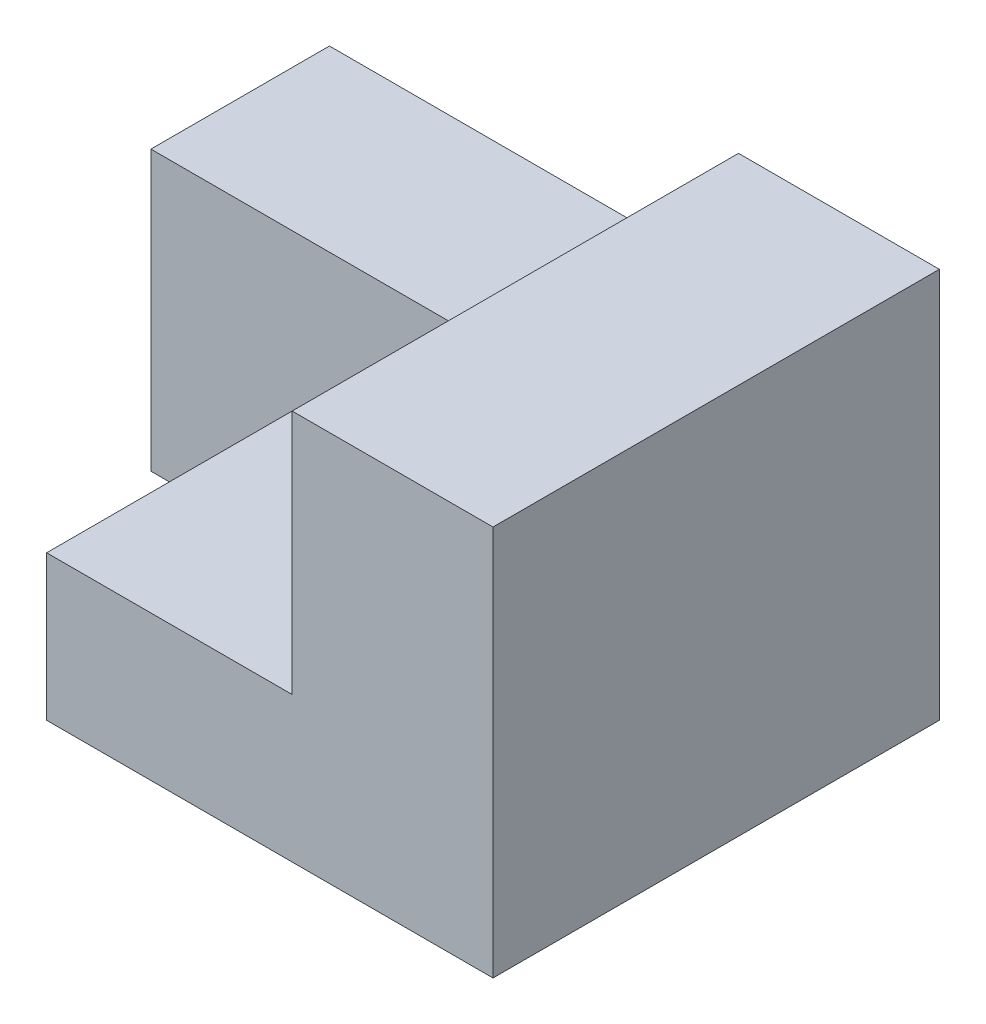
ISO-10303-21;
HEADER;
FILE_DESCRIPTION(('STEP AP214'),'2;1');
FILE_NAME('part.step','',(''),(''),'','','');
FILE_SCHEMA(('AUTOMOTIVE_DESIGN { 1 0 10303 214 1 1 1 1 }'));
ENDSEC;
DATA;
#1=APPLICATION_CONTEXT('core data for automotive mechanical design processes');
#2=APPLICATION_PROTOCOL_DEFINITION('international standard','automotive_design',2000,#1);
#3=PRODUCT_CONTEXT('',#1,'mechanical');
#4=PRODUCT('Part','Part','',(#3));
#5=PRODUCT_RELATED_PRODUCT_CATEGORY('part','',(#4));
#6=PRODUCT_DEFINITION_FORMATION('','',#4);
#7=PRODUCT_DEFINITION_CONTEXT('part definition',#1,'design');
#8=PRODUCT_DEFINITION('design','',#6,#7);
#9=PRODUCT_DEFINITION_SHAPE('','',#8);
#10=(LENGTH_UNIT() NAMED_UNIT(*) SI_UNIT(.MILLI.,.METRE.));
#11=(NAMED_UNIT(*) PLANE_ANGLE_UNIT() SI_UNIT($,.RADIAN.));
#12=(NAMED_UNIT(*) SI_UNIT($,.STERADIAN.) SOLID_ANGLE_UNIT());
#13=UNCERTAINTY_MEASURE_WITH_UNIT(LENGTH_MEASURE(1.E-05),#10,'distance_accuracy_value','');
#14=(GEOMETRIC_REPRESENTATION_CONTEXT(3) GLOBAL_UNCERTAINTY_ASSIGNED_CONTEXT((#13)) GLOBAL_UNIT_ASSIGNED_CONTEXT((#10,
#11,#12)) REPRESENTATION_CONTEXT('',''));
#15=CARTESIAN_POINT('',(0.,0.,0.));
#16=DIRECTION('',(0.,0.,1.));
#17=DIRECTION('',(1.,0.,0.));
#18=AXIS2_PLACEMENT_3D('',#15,#16,#17);
#19=CARTESIAN_POINT('',(-40.,0.,-40.));
#20=DIRECTION('',(0.,-1.,0.));
#21=DIRECTION('',(0.,0.,-1.));
#22=AXIS2_PLACEMENT_3D('',#19,#20,#21);
#23=PLANE('',#22);
#24=DIRECTION('',(1.,0.,0.));
#25=VECTOR('',#24,1.);
#26=CARTESIAN_POINT('',(-40.,0.,0.));
#27=LINE('',#26,#25);
#28=CARTESIAN_POINT('',(-40.,0.,0.));
#29=VERTEX_POINT('',#28);
#30=CARTESIAN_POINT('',(0.,0.,0.));
#31=VERTEX_POINT('',#30);
#32=EDGE_CURVE('E141',#29,#31,#27,.T.);
#33=ORIENTED_EDGE('',*,*,#32,.F.);
#34=DIRECTION('',(0.,0.,1.));
#35=VECTOR('',#34,1.);
#36=CARTESIAN_POINT('',(-40.,0.,-40.));
#37=LINE('',#36,#35);
#38=CARTESIAN_POINT('',(-40.,0.,-24.));
#39=VERTEX_POINT('',#38);
#40=EDGE_CURVE('E11',#39,#29,#37,.T.);
#41=ORIENTED_EDGE('',*,*,#40,.F.);
#42=DIRECTION('',(-1.,0.,0.));
#43=VECTOR('',#42,1.);
#44=CARTESIAN_POINT('',(-54.6578217017532,0.,-24.));
#45=LINE('',#44,#43);
#46=CARTESIAN_POINT('',(-54.6578217017532,0.,-24.));
#47=VERTEX_POINT('',#46);
#48=EDGE_CURVE('E122',#39,#47,#45,.T.);
#49=ORIENTED_EDGE('',*,*,#48,.T.);
#50=DIRECTION('',(0.,0.,-1.));
#51=VECTOR('',#50,1.);
#52=CARTESIAN_POINT('',(-54.6578217017532,0.,-24.));
#53=LINE('',#52,#51);
#54=CARTESIAN_POINT('',(-54.6578217017532,0.,-40.));
#55=VERTEX_POINT('',#54);
#56=EDGE_CURVE('E106',#47,#55,#53,.T.);
#57=ORIENTED_EDGE('',*,*,#56,.T.);
#58=DIRECTION('',(1.,0.,0.));
#59=VECTOR('',#58,1.);
#60=CARTESIAN_POINT('',(-40.,0.,-40.));
#61=LINE('',#60,#59);
#62=CARTESIAN_POINT('',(0.,0.,-40.));
#63=VERTEX_POINT('',#62);
#64=EDGE_CURVE('E143',#55,#63,#61,.T.);
#65=ORIENTED_EDGE('',*,*,#64,.T.);
#66=DIRECTION('',(0.,0.,1.));
#67=VECTOR('',#66,1.);
#68=CARTESIAN_POINT('',(0.,0.,-40.));
#69=LINE('',#68,#67);
#70=EDGE_CURVE('E36',#63,#31,#69,.T.);
#71=ORIENTED_EDGE('',*,*,#70,.T.);
#72=EDGE_LOOP('',(#33,#41,#49,#57,#65,#71));
#73=FACE_BOUND('',#72,.T.);
#74=ADVANCED_FACE('F33',(#73),#23,.T.);
#75=CARTESIAN_POINT('',(-40.,13.,-40.));
#76=DIRECTION('',(-1.,0.,0.));
#77=DIRECTION('',(0.,0.,1.));
#78=AXIS2_PLACEMENT_3D('',#75,#76,#77);
#79=PLANE('',#78);
#80=DIRECTION('',(0.,-1.,0.));
#81=VECTOR('',#80,1.);
#82=CARTESIAN_POINT('',(-40.,0.,-24.));
#83=LINE('',#82,#81);
#84=CARTESIAN_POINT('',(-40.,13.,-24.));
#85=VERTEX_POINT('',#84);
#86=EDGE_CURVE('E48',#85,#39,#83,.T.);
#87=ORIENTED_EDGE('',*,*,#86,.T.);
#88=ORIENTED_EDGE('',*,*,#40,.T.);
#89=DIRECTION('',(0.,-1.,0.));
#90=VECTOR('',#89,1.);
#91=CARTESIAN_POINT('',(-40.,13.,0.));
#92=LINE('',#91,#90);
#93=CARTESIAN_POINT('',(-40.,13.,0.));
#94=VERTEX_POINT('',#93);
#95=EDGE_CURVE('E146',#94,#29,#92,.T.);
#96=ORIENTED_EDGE('',*,*,#95,.F.);
#97=DIRECTION('',(0.,0.,1.));
#98=VECTOR('',#97,1.);
#99=CARTESIAN_POINT('',(-40.,13.,-40.));
#100=LINE('',#99,#98);
#101=EDGE_CURVE('E41',#85,#94,#100,.T.);
#102=ORIENTED_EDGE('',*,*,#101,.F.);
#103=EDGE_LOOP('',(#87,#88,#96,#102));
#104=FACE_BOUND('',#103,.T.);
#105=ADVANCED_FACE('F184',(#104),#79,.T.);
#106=CARTESIAN_POINT('',(-18.,13.,-40.));
#107=DIRECTION('',(0.,1.,0.));
#108=DIRECTION('',(-1.,0.,0.));
#109=AXIS2_PLACEMENT_3D('',#106,#107,#108);
#110=PLANE('',#109);
#111=DIRECTION('',(-1.,0.,0.));
#112=VECTOR('',#111,1.);
#113=CARTESIAN_POINT('',(-40.,13.,-24.));
#114=LINE('',#113,#112);
#115=CARTESIAN_POINT('',(-18.,13.,-24.));
#116=VERTEX_POINT('',#115);
#117=EDGE_CURVE('E56',#116,#85,#114,.T.);
#118=ORIENTED_EDGE('',*,*,#117,.T.);
#119=ORIENTED_EDGE('',*,*,#101,.T.);
#120=DIRECTION('',(-1.,0.,0.));
#121=VECTOR('',#120,1.);
#122=CARTESIAN_POINT('',(-18.,13.,0.));
#123=LINE('',#122,#121);
#124=CARTESIAN_POINT('',(-18.,13.,0.));
#125=VERTEX_POINT('',#124);
#126=EDGE_CURVE('E165',#125,#94,#123,.T.);
#127=ORIENTED_EDGE('',*,*,#126,.F.);
#128=DIRECTION('',(0.,0.,1.));
#129=VECTOR('',#128,1.);
#130=CARTESIAN_POINT('',(-18.,13.,-40.));
#131=LINE('',#130,#129);
#132=EDGE_CURVE('E171',#116,#125,#131,.T.);
#133=ORIENTED_EDGE('',*,*,#132,.F.);
#134=EDGE_LOOP('',(#118,#119,#127,#133));
#135=FACE_BOUND('',#134,.T.);
#136=ADVANCED_FACE('F188',(#135),#110,.T.);
#137=CARTESIAN_POINT('',(-18.,35.,-40.));
#138=DIRECTION('',(-1.,0.,0.));
#139=DIRECTION('',(0.,-1.,0.));
#140=AXIS2_PLACEMENT_3D('',#137,#138,#139);
#141=PLANE('',#140);
#142=DIRECTION('',(0.,0.,-1.));
#143=VECTOR('',#142,1.);
#144=CARTESIAN_POINT('',(-18.,25.,-24.));
#145=LINE('',#144,#143);
#146=CARTESIAN_POINT('',(-18.,25.,-24.));
#147=VERTEX_POINT('',#146);
#148=CARTESIAN_POINT('',(-18.,25.,-40.));
#149=VERTEX_POINT('',#148);
#150=EDGE_CURVE('E138',#147,#149,#145,.T.);
#151=ORIENTED_EDGE('',*,*,#150,.F.);
#152=DIRECTION('',(0.,-1.,0.));
#153=VECTOR('',#152,1.);
#154=CARTESIAN_POINT('',(-18.,13.,-24.));
#155=LINE('',#154,#153);
#156=EDGE_CURVE('E116',#147,#116,#155,.T.);
#157=ORIENTED_EDGE('',*,*,#156,.T.);
#158=ORIENTED_EDGE('',*,*,#132,.T.);
#159=DIRECTION('',(0.,-1.,0.));
#160=VECTOR('',#159,1.);
#161=CARTESIAN_POINT('',(-18.,35.,0.));
#162=LINE('',#161,#160);
#163=CARTESIAN_POINT('',(-18.,35.,0.));
#164=VERTEX_POINT('',#163);
#165=EDGE_CURVE('E162',#164,#125,#162,.T.);
#166=ORIENTED_EDGE('',*,*,#165,.F.);
#167=DIRECTION('',(0.,0.,1.));
#168=VECTOR('',#167,1.);
#169=CARTESIAN_POINT('',(-18.,35.,-40.));
#170=LINE('',#169,#168);
#171=CARTESIAN_POINT('',(-18.,35.,-40.));
#172=VERTEX_POINT('',#171);
#173=EDGE_CURVE('E173',#172,#164,#170,.T.);
#174=ORIENTED_EDGE('',*,*,#173,.F.);
#175=DIRECTION('',(0.,-1.,0.));
#176=VECTOR('',#175,1.);
#177=CARTESIAN_POINT('',(-18.,35.,-40.));
#178=LINE('',#177,#176);
#179=EDGE_CURVE('E152',#172,#149,#178,.T.);
#180=ORIENTED_EDGE('',*,*,#179,.T.);
#181=EDGE_LOOP('',(#151,#157,#158,#166,#174,#180));
#182=FACE_BOUND('',#181,.T.);
#183=ADVANCED_FACE('F186',(#182),#141,.T.);
#184=CARTESIAN_POINT('',(0.,35.,-40.));
#185=DIRECTION('',(0.,1.,0.));
#186=DIRECTION('',(0.,0.,1.));
#187=AXIS2_PLACEMENT_3D('',#184,#185,#186);
#188=PLANE('',#187);
#189=DIRECTION('',(-1.,0.,0.));
#190=VECTOR('',#189,1.);
#191=CARTESIAN_POINT('',(0.,35.,0.));
#192=LINE('',#191,#190);
#193=CARTESIAN_POINT('',(0.,35.,0.));
#194=VERTEX_POINT('',#193);
#195=EDGE_CURVE('E159',#194,#164,#192,.T.);
#196=ORIENTED_EDGE('',*,*,#195,.F.);
#197=DIRECTION('',(0.,0.,1.));
#198=VECTOR('',#197,1.);
#199=CARTESIAN_POINT('',(0.,35.,-40.));
#200=LINE('',#199,#198);
#201=CARTESIAN_POINT('',(0.,35.,-40.));
#202=VERTEX_POINT('',#201);
#203=EDGE_CURVE('E174',#202,#194,#200,.T.);
#204=ORIENTED_EDGE('',*,*,#203,.F.);
#205=DIRECTION('',(-1.,0.,0.));
#206=VECTOR('',#205,1.);
#207=CARTESIAN_POINT('',(0.,35.,-40.));
#208=LINE('',#207,#206);
#209=EDGE_CURVE('E149',#202,#172,#208,.T.);
#210=ORIENTED_EDGE('',*,*,#209,.T.);
#211=ORIENTED_EDGE('',*,*,#173,.T.);
#212=EDGE_LOOP('',(#196,#204,#210,#211));
#213=FACE_BOUND('',#212,.T.);
#214=ADVANCED_FACE('F195',(#213),#188,.T.);
#215=CARTESIAN_POINT('',(0.,0.,-40.));
#216=DIRECTION('',(1.,0.,0.));
#217=DIRECTION('',(0.,0.,-1.));
#218=AXIS2_PLACEMENT_3D('',#215,#216,#217);
#219=PLANE('',#218);
#220=DIRECTION('',(0.,1.,0.));
#221=VECTOR('',#220,1.);
#222=CARTESIAN_POINT('',(0.,0.,0.));
#223=LINE('',#222,#221);
#224=EDGE_CURVE('E156',#31,#194,#223,.T.);
#225=ORIENTED_EDGE('',*,*,#224,.F.);
#226=ORIENTED_EDGE('',*,*,#70,.F.);
#227=DIRECTION('',(0.,1.,0.));
#228=VECTOR('',#227,1.);
#229=CARTESIAN_POINT('',(0.,0.,-40.));
#230=LINE('',#229,#228);
#231=EDGE_CURVE('E145',#63,#202,#230,.T.);
#232=ORIENTED_EDGE('',*,*,#231,.T.);
#233=ORIENTED_EDGE('',*,*,#203,.T.);
#234=EDGE_LOOP('',(#225,#226,#232,#233));
#235=FACE_BOUND('',#234,.T.);
#236=ADVANCED_FACE('F179',(#235),#219,.T.);
#237=CARTESIAN_POINT('',(0.,0.,-40.));
#238=DIRECTION('',(0.,0.,1.));
#239=DIRECTION('',(1.,0.,0.));
#240=AXIS2_PLACEMENT_3D('',#237,#238,#239);
#241=PLANE('',#240);
#242=ORIENTED_EDGE('',*,*,#64,.F.);
#243=DIRECTION('',(0.,1.,0.));
#244=VECTOR('',#243,1.);
#245=CARTESIAN_POINT('',(-54.6578217017532,25.,-40.));
#246=LINE('',#245,#244);
#247=CARTESIAN_POINT('',(-54.6578217017532,25.,-40.));
#248=VERTEX_POINT('',#247);
#249=EDGE_CURVE('E111',#55,#248,#246,.T.);
#250=ORIENTED_EDGE('',*,*,#249,.T.);
#251=DIRECTION('',(1.,0.,0.));
#252=VECTOR('',#251,1.);
#253=CARTESIAN_POINT('',(-18.,25.,-40.));
#254=LINE('',#253,#252);
#255=EDGE_CURVE('E135',#248,#149,#254,.T.);
#256=ORIENTED_EDGE('',*,*,#255,.T.);
#257=ORIENTED_EDGE('',*,*,#179,.F.);
#258=ORIENTED_EDGE('',*,*,#209,.F.);
#259=ORIENTED_EDGE('',*,*,#231,.F.);
#260=EDGE_LOOP('',(#242,#250,#256,#257,#258,#259));
#261=FACE_BOUND('',#260,.T.);
#262=ADVANCED_FACE('F193',(#261),#241,.F.);
#263=CARTESIAN_POINT('',(0.,0.,0.));
#264=DIRECTION('',(0.,0.,1.));
#265=DIRECTION('',(1.,0.,0.));
#266=AXIS2_PLACEMENT_3D('',#263,#264,#265);
#267=PLANE('',#266);
#268=ORIENTED_EDGE('',*,*,#32,.T.);
#269=ORIENTED_EDGE('',*,*,#224,.T.);
#270=ORIENTED_EDGE('',*,*,#195,.T.);
#271=ORIENTED_EDGE('',*,*,#165,.T.);
#272=ORIENTED_EDGE('',*,*,#126,.T.);
#273=ORIENTED_EDGE('',*,*,#95,.T.);
#274=EDGE_LOOP('',(#268,#269,#270,#271,#272,#273));
#275=FACE_BOUND('',#274,.T.);
#276=ADVANCED_FACE('F181',(#275),#267,.T.);
#277=CARTESIAN_POINT('',(-18.,25.,-24.));
#278=DIRECTION('',(0.,1.,0.));
#279=DIRECTION('',(0.,0.,1.));
#280=AXIS2_PLACEMENT_3D('',#277,#278,#279);
#281=PLANE('',#280);
#282=ORIENTED_EDGE('',*,*,#255,.F.);
#283=DIRECTION('',(0.,0.,-1.));
#284=VECTOR('',#283,1.);
#285=CARTESIAN_POINT('',(-54.6578217017532,25.,-24.));
#286=LINE('',#285,#284);
#287=CARTESIAN_POINT('',(-54.6578217017532,25.,-24.));
#288=VERTEX_POINT('',#287);
#289=EDGE_CURVE('E115',#288,#248,#286,.T.);
#290=ORIENTED_EDGE('',*,*,#289,.F.);
#291=DIRECTION('',(1.,0.,0.));
#292=VECTOR('',#291,1.);
#293=CARTESIAN_POINT('',(-18.,25.,-24.));
#294=LINE('',#293,#292);
#295=EDGE_CURVE('E125',#288,#147,#294,.T.);
#296=ORIENTED_EDGE('',*,*,#295,.T.);
#297=ORIENTED_EDGE('',*,*,#150,.T.);
#298=EDGE_LOOP('',(#282,#290,#296,#297));
#299=FACE_BOUND('',#298,.T.);
#300=ADVANCED_FACE('F215',(#299),#281,.T.);
#301=CARTESIAN_POINT('',(-54.6578217017532,25.,-24.));
#302=DIRECTION('',(-1.,0.,0.));
#303=DIRECTION('',(0.,0.,1.));
#304=AXIS2_PLACEMENT_3D('',#301,#302,#303);
#305=PLANE('',#304);
#306=ORIENTED_EDGE('',*,*,#249,.F.);
#307=ORIENTED_EDGE('',*,*,#56,.F.);
#308=DIRECTION('',(0.,1.,0.));
#309=VECTOR('',#308,1.);
#310=CARTESIAN_POINT('',(-54.6578217017532,25.,-24.));
#311=LINE('',#310,#309);
#312=EDGE_CURVE('E109',#47,#288,#311,.T.);
#313=ORIENTED_EDGE('',*,*,#312,.T.);
#314=ORIENTED_EDGE('',*,*,#289,.T.);
#315=EDGE_LOOP('',(#306,#307,#313,#314));
#316=FACE_BOUND('',#315,.T.);
#317=ADVANCED_FACE('F108',(#316),#305,.T.);
#318=CARTESIAN_POINT('',(0.,0.,-24.));
#319=DIRECTION('',(0.,0.,1.));
#320=DIRECTION('',(1.,0.,0.));
#321=AXIS2_PLACEMENT_3D('',#318,#319,#320);
#322=PLANE('',#321);
#323=ORIENTED_EDGE('',*,*,#117,.F.);
#324=ORIENTED_EDGE('',*,*,#156,.F.);
#325=ORIENTED_EDGE('',*,*,#295,.F.);
#326=ORIENTED_EDGE('',*,*,#312,.F.);
#327=ORIENTED_EDGE('',*,*,#48,.F.);
#328=ORIENTED_EDGE('',*,*,#86,.F.);
#329=EDGE_LOOP('',(#323,#324,#325,#326,#327,#328));
#330=FACE_BOUND('',#329,.T.);
#331=ADVANCED_FACE('F121',(#330),#322,.T.);
#332=CLOSED_SHELL('',(#74,#105,#136,#183,#214,#236,#262,#276,#300,#317,#331));
#333=MANIFOLD_SOLID_BREP('B2',#332);
#334=ADVANCED_BREP_SHAPE_REPRESENTATION('',(#18,#333),#14);
#335=SHAPE_DEFINITION_REPRESENTATION(#9,#334);
ENDSEC;
END-ISO-10303-21;
